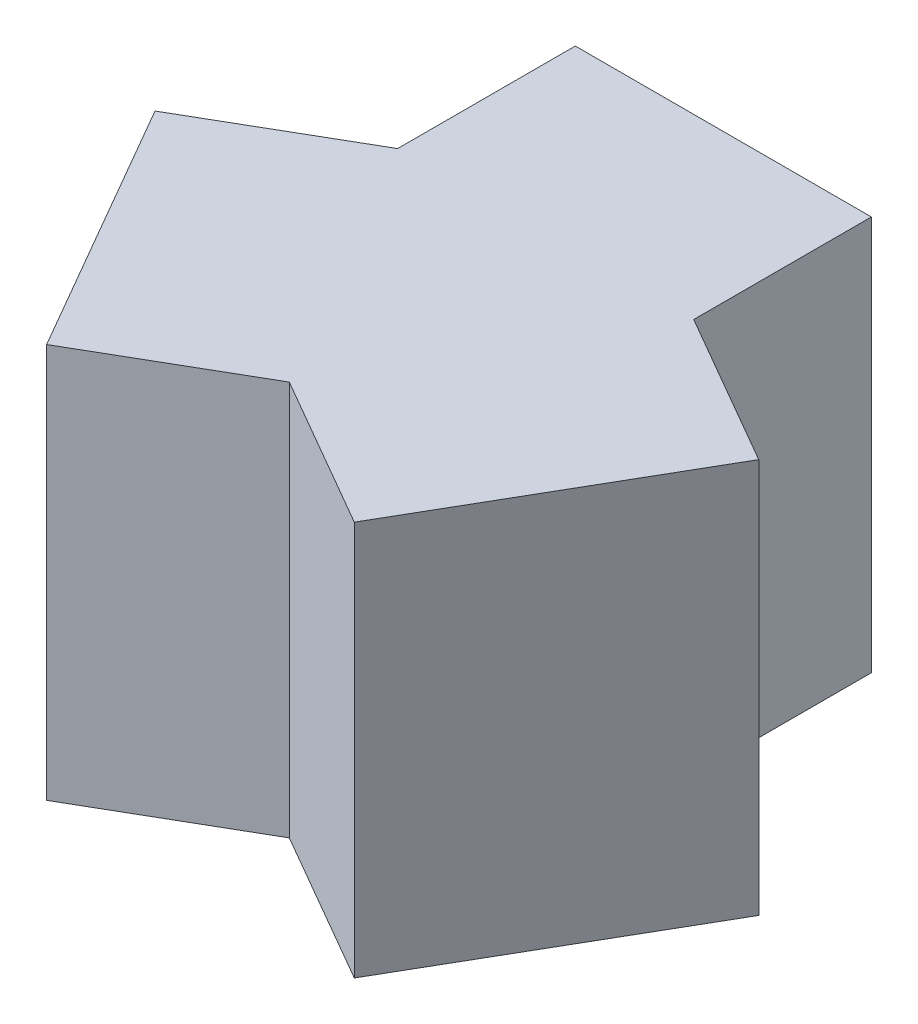
ISO-10303-21;
HEADER;
FILE_DESCRIPTION(('STEP AP214'),'2;1');
FILE_NAME('part.step','',(''),(''),'','','');
FILE_SCHEMA(('AUTOMOTIVE_DESIGN { 1 0 10303 214 1 1 1 1 }'));
ENDSEC;
DATA;
#1=APPLICATION_CONTEXT('core data for automotive mechanical design processes');
#2=APPLICATION_PROTOCOL_DEFINITION('international standard','automotive_design',2000,#1);
#3=PRODUCT_CONTEXT('',#1,'mechanical');
#4=PRODUCT('Part','Part','',(#3));
#5=PRODUCT_RELATED_PRODUCT_CATEGORY('part','',(#4));
#6=PRODUCT_DEFINITION_FORMATION('','',#4);
#7=PRODUCT_DEFINITION_CONTEXT('part definition',#1,'design');
#8=PRODUCT_DEFINITION('design','',#6,#7);
#9=PRODUCT_DEFINITION_SHAPE('','',#8);
#10=(LENGTH_UNIT() NAMED_UNIT(*) SI_UNIT(.MILLI.,.METRE.));
#11=(NAMED_UNIT(*) PLANE_ANGLE_UNIT() SI_UNIT($,.RADIAN.));
#12=(NAMED_UNIT(*) SI_UNIT($,.STERADIAN.) SOLID_ANGLE_UNIT());
#13=UNCERTAINTY_MEASURE_WITH_UNIT(LENGTH_MEASURE(1.E-05),#10,'distance_accuracy_value','');
#14=(GEOMETRIC_REPRESENTATION_CONTEXT(3) GLOBAL_UNCERTAINTY_ASSIGNED_CONTEXT((#13)) GLOBAL_UNIT_ASSIGNED_CONTEXT((#10,
#11,#12)) REPRESENTATION_CONTEXT('',''));
#15=CARTESIAN_POINT('',(0.,0.,0.));
#16=DIRECTION('',(0.,0.,1.));
#17=DIRECTION('',(1.,0.,0.));
#18=AXIS2_PLACEMENT_3D('',#15,#16,#17);
#19=CARTESIAN_POINT('',(7.50000000000006,10.,-5.));
#20=DIRECTION('',(-1.,0.,0.));
#21=DIRECTION('',(0.,0.,1.));
#22=AXIS2_PLACEMENT_3D('',#19,#20,#21);
#23=PLANE('',#22);
#24=DIRECTION('',(0.,0.,-1.));
#25=VECTOR('',#24,1.);
#26=CARTESIAN_POINT('',(7.50000000000006,-10.,-5.));
#27=LINE('',#26,#25);
#28=CARTESIAN_POINT('',(7.50000000000006,-10.,-5.));
#29=VERTEX_POINT('',#28);
#30=CARTESIAN_POINT('',(7.50000000000006,-10.,-14.));
#31=VERTEX_POINT('',#30);
#32=EDGE_CURVE('E146',#29,#31,#27,.T.);
#33=ORIENTED_EDGE('',*,*,#32,.T.);
#34=DIRECTION('',(0.,-1.,0.));
#35=VECTOR('',#34,1.);
#36=CARTESIAN_POINT('',(7.50000000000006,10.,-14.));
#37=LINE('',#36,#35);
#38=CARTESIAN_POINT('',(7.50000000000006,10.,-14.));
#39=VERTEX_POINT('',#38);
#40=EDGE_CURVE('E11',#39,#31,#37,.T.);
#41=ORIENTED_EDGE('',*,*,#40,.F.);
#42=DIRECTION('',(0.,0.,-1.));
#43=VECTOR('',#42,1.);
#44=CARTESIAN_POINT('',(7.50000000000006,10.,-5.));
#45=LINE('',#44,#43);
#46=CARTESIAN_POINT('',(7.50000000000006,10.,-5.));
#47=VERTEX_POINT('',#46);
#48=EDGE_CURVE('E171',#47,#39,#45,.T.);
#49=ORIENTED_EDGE('',*,*,#48,.F.);
#50=DIRECTION('',(0.,-1.,0.));
#51=VECTOR('',#50,1.);
#52=CARTESIAN_POINT('',(7.50000000000006,10.,-5.));
#53=LINE('',#52,#51);
#54=EDGE_CURVE('E142',#47,#29,#53,.T.);
#55=ORIENTED_EDGE('',*,*,#54,.T.);
#56=EDGE_LOOP('',(#33,#41,#49,#55));
#57=FACE_BOUND('',#56,.T.);
#58=ADVANCED_FACE('F39',(#57),#23,.F.);
#59=CARTESIAN_POINT('',(-7.50000000000006,10.,-14.));
#60=DIRECTION('',(0.,0.,1.));
#61=DIRECTION('',(1.,0.,0.));
#62=AXIS2_PLACEMENT_3D('',#59,#60,#61);
#63=PLANE('',#62);
#64=DIRECTION('',(-1.,0.,0.));
#65=VECTOR('',#64,1.);
#66=CARTESIAN_POINT('',(-7.50000000000006,-10.,-14.));
#67=LINE('',#66,#65);
#68=CARTESIAN_POINT('',(-7.50000000000006,-10.,-14.));
#69=VERTEX_POINT('',#68);
#70=EDGE_CURVE('E150',#31,#69,#67,.T.);
#71=ORIENTED_EDGE('',*,*,#70,.T.);
#72=DIRECTION('',(0.,-1.,0.));
#73=VECTOR('',#72,1.);
#74=CARTESIAN_POINT('',(-7.50000000000006,10.,-14.));
#75=LINE('',#74,#73);
#76=CARTESIAN_POINT('',(-7.50000000000006,10.,-14.));
#77=VERTEX_POINT('',#76);
#78=EDGE_CURVE('E48',#77,#69,#75,.T.);
#79=ORIENTED_EDGE('',*,*,#78,.F.);
#80=DIRECTION('',(-1.,0.,0.));
#81=VECTOR('',#80,1.);
#82=CARTESIAN_POINT('',(-7.50000000000006,10.,-14.));
#83=LINE('',#82,#81);
#84=EDGE_CURVE('E102',#39,#77,#83,.T.);
#85=ORIENTED_EDGE('',*,*,#84,.F.);
#86=ORIENTED_EDGE('',*,*,#40,.T.);
#87=EDGE_LOOP('',(#71,#79,#85,#86));
#88=FACE_BOUND('',#87,.T.);
#89=ADVANCED_FACE('F227',(#88),#63,.F.);
#90=CARTESIAN_POINT('',(-7.50000000000006,10.,-5.));
#91=DIRECTION('',(1.,0.,0.));
#92=DIRECTION('',(0.,0.,-1.));
#93=AXIS2_PLACEMENT_3D('',#90,#91,#92);
#94=PLANE('',#93);
#95=DIRECTION('',(0.,0.,1.));
#96=VECTOR('',#95,1.);
#97=CARTESIAN_POINT('',(-7.50000000000006,-10.,-5.));
#98=LINE('',#97,#96);
#99=CARTESIAN_POINT('',(-7.50000000000006,-10.,-5.));
#100=VERTEX_POINT('',#99);
#101=EDGE_CURVE('E153',#69,#100,#98,.T.);
#102=ORIENTED_EDGE('',*,*,#101,.T.);
#103=DIRECTION('',(0.,-1.,0.));
#104=VECTOR('',#103,1.);
#105=CARTESIAN_POINT('',(-7.50000000000006,10.,-5.));
#106=LINE('',#105,#104);
#107=CARTESIAN_POINT('',(-7.50000000000006,10.,-5.));
#108=VERTEX_POINT('',#107);
#109=EDGE_CURVE('E186',#108,#100,#106,.T.);
#110=ORIENTED_EDGE('',*,*,#109,.F.);
#111=DIRECTION('',(0.,0.,1.));
#112=VECTOR('',#111,1.);
#113=CARTESIAN_POINT('',(-7.50000000000006,10.,-5.));
#114=LINE('',#113,#112);
#115=EDGE_CURVE('E196',#77,#108,#114,.T.);
#116=ORIENTED_EDGE('',*,*,#115,.F.);
#117=ORIENTED_EDGE('',*,*,#78,.T.);
#118=EDGE_LOOP('',(#102,#110,#116,#117));
#119=FACE_BOUND('',#118,.T.);
#120=ADVANCED_FACE('F194',(#119),#94,.F.);
#121=CARTESIAN_POINT('',(-15.29422863406,10.,-0.499999999999995));
#122=DIRECTION('',(0.5,0.,0.866025403784438));
#123=DIRECTION('',(0.866025403784438,0.,-0.5));
#124=AXIS2_PLACEMENT_3D('',#121,#122,#123);
#125=PLANE('',#124);
#126=DIRECTION('',(-0.866025403784438,0.,0.5));
#127=VECTOR('',#126,1.);
#128=CARTESIAN_POINT('',(-15.29422863406,-10.,-0.499999999999995));
#129=LINE('',#128,#127);
#130=CARTESIAN_POINT('',(-15.29422863406,-10.,-0.499999999999995));
#131=VERTEX_POINT('',#130);
#132=EDGE_CURVE('E156',#100,#131,#129,.T.);
#133=ORIENTED_EDGE('',*,*,#132,.T.);
#134=DIRECTION('',(0.,-1.,0.));
#135=VECTOR('',#134,1.);
#136=CARTESIAN_POINT('',(-15.29422863406,10.,-0.499999999999995));
#137=LINE('',#136,#135);
#138=CARTESIAN_POINT('',(-15.29422863406,10.,-0.499999999999995));
#139=VERTEX_POINT('',#138);
#140=EDGE_CURVE('E182',#139,#131,#137,.T.);
#141=ORIENTED_EDGE('',*,*,#140,.F.);
#142=DIRECTION('',(-0.866025403784438,0.,0.5));
#143=VECTOR('',#142,1.);
#144=CARTESIAN_POINT('',(-15.29422863406,10.,-0.499999999999995));
#145=LINE('',#144,#143);
#146=EDGE_CURVE('E213',#108,#139,#145,.T.);
#147=ORIENTED_EDGE('',*,*,#146,.F.);
#148=ORIENTED_EDGE('',*,*,#109,.T.);
#149=EDGE_LOOP('',(#133,#141,#147,#148));
#150=FACE_BOUND('',#149,.T.);
#151=ADVANCED_FACE('F205',(#150),#125,.F.);
#152=CARTESIAN_POINT('',(-15.29422863406,10.,-0.499999999999995));
#153=DIRECTION('',(0.866025403784438,0.,-0.5));
#154=DIRECTION('',(-0.5,0.,-0.866025403784439));
#155=AXIS2_PLACEMENT_3D('',#152,#153,#154);
#156=PLANE('',#155);
#157=DIRECTION('',(0.5,0.,0.866025403784438));
#158=VECTOR('',#157,1.);
#159=CARTESIAN_POINT('',(-15.29422863406,-10.,-0.499999999999995));
#160=LINE('',#159,#158);
#161=CARTESIAN_POINT('',(-7.79422863405994,-10.,12.4903810567667));
#162=VERTEX_POINT('',#161);
#163=EDGE_CURVE('E159',#131,#162,#160,.T.);
#164=ORIENTED_EDGE('',*,*,#163,.T.);
#165=DIRECTION('',(0.,-1.,0.));
#166=VECTOR('',#165,1.);
#167=CARTESIAN_POINT('',(-7.79422863405994,10.,12.4903810567667));
#168=LINE('',#167,#166);
#169=CARTESIAN_POINT('',(-7.79422863405994,10.,12.4903810567667));
#170=VERTEX_POINT('',#169);
#171=EDGE_CURVE('E178',#170,#162,#168,.T.);
#172=ORIENTED_EDGE('',*,*,#171,.F.);
#173=DIRECTION('',(0.5,0.,0.866025403784438));
#174=VECTOR('',#173,1.);
#175=CARTESIAN_POINT('',(-15.29422863406,10.,-0.499999999999995));
#176=LINE('',#175,#174);
#177=EDGE_CURVE('E211',#139,#170,#176,.T.);
#178=ORIENTED_EDGE('',*,*,#177,.F.);
#179=ORIENTED_EDGE('',*,*,#140,.T.);
#180=EDGE_LOOP('',(#164,#172,#178,#179));
#181=FACE_BOUND('',#180,.T.);
#182=ADVANCED_FACE('F209',(#181),#156,.F.);
#183=CARTESIAN_POINT('',(0.,10.,7.99038105676669));
#184=DIRECTION('',(-0.5,0.,-0.866025403784438));
#185=DIRECTION('',(-0.866025403784439,0.,0.5));
#186=AXIS2_PLACEMENT_3D('',#183,#184,#185);
#187=PLANE('',#186);
#188=DIRECTION('',(0.866025403784439,0.,-0.5));
#189=VECTOR('',#188,1.);
#190=CARTESIAN_POINT('',(0.,-10.,7.99038105676669));
#191=LINE('',#190,#189);
#192=CARTESIAN_POINT('',(0.,-10.,7.99038105676669));
#193=VERTEX_POINT('',#192);
#194=EDGE_CURVE('E162',#162,#193,#191,.T.);
#195=ORIENTED_EDGE('',*,*,#194,.T.);
#196=DIRECTION('',(0.,-1.,0.));
#197=VECTOR('',#196,1.);
#198=CARTESIAN_POINT('',(0.,10.,7.99038105676669));
#199=LINE('',#198,#197);
#200=CARTESIAN_POINT('',(0.,10.,7.99038105676669));
#201=VERTEX_POINT('',#200);
#202=EDGE_CURVE('E135',#201,#193,#199,.T.);
#203=ORIENTED_EDGE('',*,*,#202,.F.);
#204=DIRECTION('',(0.866025403784439,0.,-0.5));
#205=VECTOR('',#204,1.);
#206=CARTESIAN_POINT('',(0.,10.,7.99038105676669));
#207=LINE('',#206,#205);
#208=EDGE_CURVE('E124',#170,#201,#207,.T.);
#209=ORIENTED_EDGE('',*,*,#208,.F.);
#210=ORIENTED_EDGE('',*,*,#171,.T.);
#211=EDGE_LOOP('',(#195,#203,#209,#210));
#212=FACE_BOUND('',#211,.T.);
#213=ADVANCED_FACE('F239',(#212),#187,.F.);
#214=CARTESIAN_POINT('',(0.,10.,7.99038105676669));
#215=DIRECTION('',(0.5,0.,-0.866025403784439));
#216=DIRECTION('',(-0.866025403784439,0.,-0.5));
#217=AXIS2_PLACEMENT_3D('',#214,#215,#216);
#218=PLANE('',#217);
#219=DIRECTION('',(0.866025403784439,0.,0.499999999999999));
#220=VECTOR('',#219,1.);
#221=CARTESIAN_POINT('',(0.,-10.,7.99038105676669));
#222=LINE('',#221,#220);
#223=CARTESIAN_POINT('',(7.79422863405995,-10.,12.4903810567667));
#224=VERTEX_POINT('',#223);
#225=EDGE_CURVE('E133',#193,#224,#222,.T.);
#226=ORIENTED_EDGE('',*,*,#225,.T.);
#227=DIRECTION('',(0.,-1.,0.));
#228=VECTOR('',#227,1.);
#229=CARTESIAN_POINT('',(7.79422863405995,10.,12.4903810567667));
#230=LINE('',#229,#228);
#231=CARTESIAN_POINT('',(7.79422863405995,10.,12.4903810567667));
#232=VERTEX_POINT('',#231);
#233=EDGE_CURVE('E130',#232,#224,#230,.T.);
#234=ORIENTED_EDGE('',*,*,#233,.F.);
#235=DIRECTION('',(0.866025403784439,0.,0.499999999999999));
#236=VECTOR('',#235,1.);
#237=CARTESIAN_POINT('',(0.,10.,7.99038105676669));
#238=LINE('',#237,#236);
#239=EDGE_CURVE('E118',#201,#232,#238,.T.);
#240=ORIENTED_EDGE('',*,*,#239,.F.);
#241=ORIENTED_EDGE('',*,*,#202,.T.);
#242=EDGE_LOOP('',(#226,#234,#240,#241));
#243=FACE_BOUND('',#242,.T.);
#244=ADVANCED_FACE('F131',(#243),#218,.F.);
#245=CARTESIAN_POINT('',(15.29422863406,10.,-0.499999999999999));
#246=DIRECTION('',(-0.866025403784439,0.,-0.5));
#247=DIRECTION('',(-0.5,0.,0.866025403784439));
#248=AXIS2_PLACEMENT_3D('',#245,#246,#247);
#249=PLANE('',#248);
#250=DIRECTION('',(0.5,0.,-0.866025403784439));
#251=VECTOR('',#250,1.);
#252=CARTESIAN_POINT('',(15.29422863406,-10.,-0.499999999999999));
#253=LINE('',#252,#251);
#254=CARTESIAN_POINT('',(15.29422863406,-10.,-0.499999999999999));
#255=VERTEX_POINT('',#254);
#256=EDGE_CURVE('E88',#224,#255,#253,.T.);
#257=ORIENTED_EDGE('',*,*,#256,.T.);
#258=DIRECTION('',(0.,-1.,0.));
#259=VECTOR('',#258,1.);
#260=CARTESIAN_POINT('',(15.29422863406,10.,-0.499999999999999));
#261=LINE('',#260,#259);
#262=CARTESIAN_POINT('',(15.29422863406,10.,-0.499999999999999));
#263=VERTEX_POINT('',#262);
#264=EDGE_CURVE('E136',#263,#255,#261,.T.);
#265=ORIENTED_EDGE('',*,*,#264,.F.);
#266=DIRECTION('',(0.5,0.,-0.866025403784439));
#267=VECTOR('',#266,1.);
#268=CARTESIAN_POINT('',(15.29422863406,10.,-0.499999999999999));
#269=LINE('',#268,#267);
#270=EDGE_CURVE('E122',#232,#263,#269,.T.);
#271=ORIENTED_EDGE('',*,*,#270,.F.);
#272=ORIENTED_EDGE('',*,*,#233,.T.);
#273=EDGE_LOOP('',(#257,#265,#271,#272));
#274=FACE_BOUND('',#273,.T.);
#275=ADVANCED_FACE('F138',(#274),#249,.F.);
#276=CARTESIAN_POINT('',(15.29422863406,10.,-0.499999999999999));
#277=DIRECTION('',(-0.5,0.,0.866025403784439));
#278=DIRECTION('',(0.866025403784439,0.,0.5));
#279=AXIS2_PLACEMENT_3D('',#276,#277,#278);
#280=PLANE('',#279);
#281=DIRECTION('',(-0.866025403784439,0.,-0.5));
#282=VECTOR('',#281,1.);
#283=CARTESIAN_POINT('',(15.29422863406,-10.,-0.499999999999999));
#284=LINE('',#283,#282);
#285=EDGE_CURVE('E94',#255,#29,#284,.T.);
#286=ORIENTED_EDGE('',*,*,#285,.T.);
#287=ORIENTED_EDGE('',*,*,#54,.F.);
#288=DIRECTION('',(-0.866025403784439,0.,-0.5));
#289=VECTOR('',#288,1.);
#290=CARTESIAN_POINT('',(15.29422863406,10.,-0.499999999999999));
#291=LINE('',#290,#289);
#292=EDGE_CURVE('E56',#263,#47,#291,.T.);
#293=ORIENTED_EDGE('',*,*,#292,.F.);
#294=ORIENTED_EDGE('',*,*,#264,.T.);
#295=EDGE_LOOP('',(#286,#287,#293,#294));
#296=FACE_BOUND('',#295,.T.);
#297=ADVANCED_FACE('F247',(#296),#280,.F.);
#298=CARTESIAN_POINT('',(0.,10.,0.));
#299=DIRECTION('',(0.,-1.,0.));
#300=DIRECTION('',(0.,0.,-1.));
#301=AXIS2_PLACEMENT_3D('',#298,#299,#300);
#302=PLANE('',#301);
#303=ORIENTED_EDGE('',*,*,#48,.T.);
#304=ORIENTED_EDGE('',*,*,#84,.T.);
#305=ORIENTED_EDGE('',*,*,#115,.T.);
#306=ORIENTED_EDGE('',*,*,#146,.T.);
#307=ORIENTED_EDGE('',*,*,#177,.T.);
#308=ORIENTED_EDGE('',*,*,#208,.T.);
#309=ORIENTED_EDGE('',*,*,#239,.T.);
#310=ORIENTED_EDGE('',*,*,#270,.T.);
#311=ORIENTED_EDGE('',*,*,#292,.T.);
#312=EDGE_LOOP('',(#303,#304,#305,#306,#307,#308,#309,#310,#311));
#313=FACE_BOUND('',#312,.T.);
#314=ADVANCED_FACE('F120',(#313),#302,.F.);
#315=CARTESIAN_POINT('',(0.,-10.,0.));
#316=DIRECTION('',(0.,-1.,0.));
#317=DIRECTION('',(0.,0.,-1.));
#318=AXIS2_PLACEMENT_3D('',#315,#316,#317);
#319=PLANE('',#318);
#320=ORIENTED_EDGE('',*,*,#32,.F.);
#321=ORIENTED_EDGE('',*,*,#285,.F.);
#322=ORIENTED_EDGE('',*,*,#256,.F.);
#323=ORIENTED_EDGE('',*,*,#225,.F.);
#324=ORIENTED_EDGE('',*,*,#194,.F.);
#325=ORIENTED_EDGE('',*,*,#163,.F.);
#326=ORIENTED_EDGE('',*,*,#132,.F.);
#327=ORIENTED_EDGE('',*,*,#101,.F.);
#328=ORIENTED_EDGE('',*,*,#70,.F.);
#329=EDGE_LOOP('',(#320,#321,#322,#323,#324,#325,#326,#327,#328));
#330=FACE_BOUND('',#329,.T.);
#331=ADVANCED_FACE('F200',(#330),#319,.T.);
#332=CLOSED_SHELL('',(#58,#89,#120,#151,#182,#213,#244,#275,#297,#314,#331));
#333=MANIFOLD_SOLID_BREP('B2',#332);
#334=ADVANCED_BREP_SHAPE_REPRESENTATION('',(#18,#333),#14);
#335=SHAPE_DEFINITION_REPRESENTATION(#9,#334);
ENDSEC;
END-ISO-10303-21;
